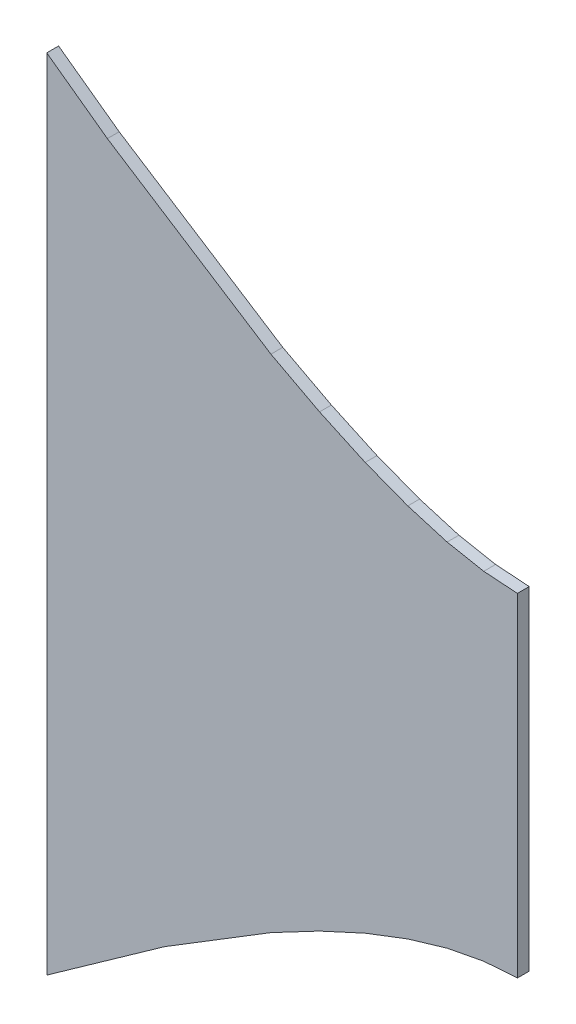
ISO-10303-21;
HEADER;
FILE_DESCRIPTION(('STEP AP214'),'2;1');
FILE_NAME('part.step','',(''),(''),'','','');
FILE_SCHEMA(('AUTOMOTIVE_DESIGN { 1 0 10303 214 1 1 1 1 }'));
ENDSEC;
DATA;
#1=APPLICATION_CONTEXT('core data for automotive mechanical design processes');
#2=APPLICATION_PROTOCOL_DEFINITION('international standard','automotive_design',2000,#1);
#3=PRODUCT_CONTEXT('',#1,'mechanical');
#4=PRODUCT('Part','Part','',(#3));
#5=PRODUCT_RELATED_PRODUCT_CATEGORY('part','',(#4));
#6=PRODUCT_DEFINITION_FORMATION('','',#4);
#7=PRODUCT_DEFINITION_CONTEXT('part definition',#1,'design');
#8=PRODUCT_DEFINITION('design','',#6,#7);
#9=PRODUCT_DEFINITION_SHAPE('','',#8);
#10=(LENGTH_UNIT() NAMED_UNIT(*) SI_UNIT(.MILLI.,.METRE.));
#11=(NAMED_UNIT(*) PLANE_ANGLE_UNIT() SI_UNIT($,.RADIAN.));
#12=(NAMED_UNIT(*) SI_UNIT($,.STERADIAN.) SOLID_ANGLE_UNIT());
#13=UNCERTAINTY_MEASURE_WITH_UNIT(LENGTH_MEASURE(1.E-05),#10,'distance_accuracy_value','');
#14=(GEOMETRIC_REPRESENTATION_CONTEXT(3) GLOBAL_UNCERTAINTY_ASSIGNED_CONTEXT((#13)) GLOBAL_UNIT_ASSIGNED_CONTEXT((#10,
#11,#12)) REPRESENTATION_CONTEXT('',''));
#15=CARTESIAN_POINT('',(0.,0.,0.));
#16=DIRECTION('',(0.,0.,1.));
#17=DIRECTION('',(1.,0.,0.));
#18=AXIS2_PLACEMENT_3D('',#15,#16,#17);
#19=CARTESIAN_POINT('',(66.213996887207,43.,0.));
#20=DIRECTION('',(-0.0691421856130917,-0.997606815418101,0.));
#21=DIRECTION('',(-0.997606815418101,0.0691421856130917,0.));
#22=AXIS2_PLACEMENT_3D('',#19,#20,#21);
#23=PLANE('',#22);
#24=DIRECTION('',(-0.997606815418101,0.0691421856130917,0.));
#25=VECTOR('',#24,1.);
#26=CARTESIAN_POINT('',(66.213996887207,43.,0.03556));
#27=LINE('',#26,#25);
#28=CARTESIAN_POINT('',(66.213996887207,43.,0.03556));
#29=VERTEX_POINT('',#28);
#30=CARTESIAN_POINT('',(66.1129989624023,43.0069999694824,0.03556));
#31=VERTEX_POINT('',#30);
#32=EDGE_CURVE('E11',#29,#31,#27,.T.);
#33=ORIENTED_EDGE('',*,*,#32,.F.);
#34=DIRECTION('',(0.,0.,1.));
#35=VECTOR('',#34,1.);
#36=CARTESIAN_POINT('',(66.213996887207,43.,0.));
#37=LINE('',#36,#35);
#38=CARTESIAN_POINT('',(66.213996887207,43.,0.));
#39=VERTEX_POINT('',#38);
#40=EDGE_CURVE('E24',#39,#29,#37,.T.);
#41=ORIENTED_EDGE('',*,*,#40,.F.);
#42=DIRECTION('',(-0.997606815418101,0.0691421856130917,0.));
#43=VECTOR('',#42,1.);
#44=CARTESIAN_POINT('',(66.213996887207,43.,0.));
#45=LINE('',#44,#43);
#46=CARTESIAN_POINT('',(66.1129989624023,43.0069999694824,0.));
#47=VERTEX_POINT('',#46);
#48=EDGE_CURVE('E160',#39,#47,#45,.T.);
#49=ORIENTED_EDGE('',*,*,#48,.T.);
#50=DIRECTION('',(0.,0.,1.));
#51=VECTOR('',#50,1.);
#52=CARTESIAN_POINT('',(66.1129989624023,43.0069999694824,0.));
#53=LINE('',#52,#51);
#54=EDGE_CURVE('E37',#47,#31,#53,.T.);
#55=ORIENTED_EDGE('',*,*,#54,.T.);
#56=EDGE_LOOP('',(#33,#41,#49,#55));
#57=FACE_BOUND('',#56,.T.);
#58=ADVANCED_FACE('F17',(#57),#23,.F.);
#59=CARTESIAN_POINT('',(66.1129989624023,43.0069999694824,0.));
#60=DIRECTION('',(-0.18752063241692,-0.982260664191516,0.));
#61=DIRECTION('',(-0.982260664191516,0.18752063241692,0.));
#62=AXIS2_PLACEMENT_3D('',#59,#60,#61);
#63=PLANE('',#62);
#64=DIRECTION('',(-0.982260664191516,0.18752063241692,0.));
#65=VECTOR('',#64,1.);
#66=CARTESIAN_POINT('',(66.1129989624023,43.0069999694824,0.03556));
#67=LINE('',#66,#65);
#68=CARTESIAN_POINT('',(66.0029983520508,43.0279998779297,0.03556));
#69=VERTEX_POINT('',#68);
#70=EDGE_CURVE('E280',#31,#69,#67,.T.);
#71=ORIENTED_EDGE('',*,*,#70,.F.);
#72=ORIENTED_EDGE('',*,*,#54,.F.);
#73=DIRECTION('',(-0.982260664191516,0.18752063241692,0.));
#74=VECTOR('',#73,1.);
#75=CARTESIAN_POINT('',(66.1129989624023,43.0069999694824,0.));
#76=LINE('',#75,#74);
#77=CARTESIAN_POINT('',(66.0029983520508,43.0279998779297,0.));
#78=VERTEX_POINT('',#77);
#79=EDGE_CURVE('E277',#47,#78,#76,.T.);
#80=ORIENTED_EDGE('',*,*,#79,.T.);
#81=DIRECTION('',(0.,0.,1.));
#82=VECTOR('',#81,1.);
#83=CARTESIAN_POINT('',(66.0029983520508,43.0279998779297,0.));
#84=LINE('',#83,#82);
#85=EDGE_CURVE('E275',#78,#69,#84,.T.);
#86=ORIENTED_EDGE('',*,*,#85,.T.);
#87=EDGE_LOOP('',(#71,#72,#80,#86));
#88=FACE_BOUND('',#87,.T.);
#89=ADVANCED_FACE('F288',(#88),#63,.F.);
#90=CARTESIAN_POINT('',(66.0029983520508,43.0279998779297,0.));
#91=DIRECTION('',(-0.284372190121849,-0.958713960201531,0.));
#92=DIRECTION('',(-0.958713960201531,0.284372190121849,0.));
#93=AXIS2_PLACEMENT_3D('',#90,#91,#92);
#94=PLANE('',#93);
#95=DIRECTION('',(-0.958713960201531,0.284372190121849,0.));
#96=VECTOR('',#95,1.);
#97=CARTESIAN_POINT('',(66.0029983520508,43.0279998779297,0.03556));
#98=LINE('',#97,#96);
#99=CARTESIAN_POINT('',(65.8850021362305,43.0629997253418,0.03556));
#100=VERTEX_POINT('',#99);
#101=EDGE_CURVE('E272',#69,#100,#98,.T.);
#102=ORIENTED_EDGE('',*,*,#101,.F.);
#103=ORIENTED_EDGE('',*,*,#85,.F.);
#104=DIRECTION('',(-0.958713960201531,0.284372190121849,0.));
#105=VECTOR('',#104,1.);
#106=CARTESIAN_POINT('',(66.0029983520508,43.0279998779297,0.));
#107=LINE('',#106,#105);
#108=CARTESIAN_POINT('',(65.8850021362305,43.0629997253418,0.));
#109=VERTEX_POINT('',#108);
#110=EDGE_CURVE('E269',#78,#109,#107,.T.);
#111=ORIENTED_EDGE('',*,*,#110,.T.);
#112=DIRECTION('',(0.,0.,1.));
#113=VECTOR('',#112,1.);
#114=CARTESIAN_POINT('',(65.8850021362305,43.0629997253418,0.));
#115=LINE('',#114,#113);
#116=EDGE_CURVE('E267',#109,#100,#115,.T.);
#117=ORIENTED_EDGE('',*,*,#116,.T.);
#118=EDGE_LOOP('',(#102,#103,#111,#117));
#119=FACE_BOUND('',#118,.T.);
#120=ADVANCED_FACE('F294',(#119),#94,.F.);
#121=CARTESIAN_POINT('',(65.8850021362305,43.0629997253418,0.));
#122=DIRECTION('',(-0.357514537183552,-0.933907573425995,0.));
#123=DIRECTION('',(-0.933907573425995,0.357514537183552,0.));
#124=AXIS2_PLACEMENT_3D('',#121,#122,#123);
#125=PLANE('',#124);
#126=DIRECTION('',(-0.933907573425995,0.357514537183552,0.));
#127=VECTOR('',#126,1.);
#128=CARTESIAN_POINT('',(65.8850021362305,43.0629997253418,0.03556));
#129=LINE('',#128,#127);
#130=CARTESIAN_POINT('',(65.7570037841797,43.1119995117188,0.03556));
#131=VERTEX_POINT('',#130);
#132=EDGE_CURVE('E264',#100,#131,#129,.T.);
#133=ORIENTED_EDGE('',*,*,#132,.F.);
#134=ORIENTED_EDGE('',*,*,#116,.F.);
#135=DIRECTION('',(-0.933907573425995,0.357514537183552,0.));
#136=VECTOR('',#135,1.);
#137=CARTESIAN_POINT('',(65.8850021362305,43.0629997253418,0.));
#138=LINE('',#137,#136);
#139=CARTESIAN_POINT('',(65.7570037841797,43.1119995117188,0.));
#140=VERTEX_POINT('',#139);
#141=EDGE_CURVE('E261',#109,#140,#138,.T.);
#142=ORIENTED_EDGE('',*,*,#141,.T.);
#143=DIRECTION('',(0.,0.,1.));
#144=VECTOR('',#143,1.);
#145=CARTESIAN_POINT('',(65.7570037841797,43.1119995117188,0.));
#146=LINE('',#145,#144);
#147=EDGE_CURVE('E259',#140,#131,#146,.T.);
#148=ORIENTED_EDGE('',*,*,#147,.T.);
#149=EDGE_LOOP('',(#133,#134,#142,#148));
#150=FACE_BOUND('',#149,.T.);
#151=ADVANCED_FACE('F296',(#150),#125,.F.);
#152=CARTESIAN_POINT('',(65.7570037841797,43.1119995117188,0.));
#153=DIRECTION('',(-0.417792019909642,-0.908542694703898,0.));
#154=DIRECTION('',(-0.908542694703898,0.417792019909642,0.));
#155=AXIS2_PLACEMENT_3D('',#152,#153,#154);
#156=PLANE('',#155);
#157=DIRECTION('',(-0.908542694703898,0.417792019909642,0.));
#158=VECTOR('',#157,1.);
#159=CARTESIAN_POINT('',(65.7570037841797,43.1119995117188,0.03556));
#160=LINE('',#159,#158);
#161=CARTESIAN_POINT('',(65.620002746582,43.1749992370605,0.03556));
#162=VERTEX_POINT('',#161);
#163=EDGE_CURVE('E256',#131,#162,#160,.T.);
#164=ORIENTED_EDGE('',*,*,#163,.F.);
#165=ORIENTED_EDGE('',*,*,#147,.F.);
#166=DIRECTION('',(-0.908542694703898,0.417792019909642,0.));
#167=VECTOR('',#166,1.);
#168=CARTESIAN_POINT('',(65.7570037841797,43.1119995117188,0.));
#169=LINE('',#168,#167);
#170=CARTESIAN_POINT('',(65.620002746582,43.1749992370605,0.));
#171=VERTEX_POINT('',#170);
#172=EDGE_CURVE('E253',#140,#171,#169,.T.);
#173=ORIENTED_EDGE('',*,*,#172,.T.);
#174=DIRECTION('',(0.,0.,1.));
#175=VECTOR('',#174,1.);
#176=CARTESIAN_POINT('',(65.620002746582,43.1749992370605,0.));
#177=LINE('',#176,#175);
#178=EDGE_CURVE('E251',#171,#162,#177,.T.);
#179=ORIENTED_EDGE('',*,*,#178,.T.);
#180=EDGE_LOOP('',(#164,#165,#173,#179));
#181=FACE_BOUND('',#180,.T.);
#182=ADVANCED_FACE('F301',(#181),#156,.F.);
#183=CARTESIAN_POINT('',(65.620002746582,43.1749992370605,0.));
#184=DIRECTION('',(-0.466484451675092,-0.884529398236932,0.));
#185=DIRECTION('',(-0.884529398236932,0.466484451675092,0.));
#186=AXIS2_PLACEMENT_3D('',#183,#184,#185);
#187=PLANE('',#186);
#188=DIRECTION('',(-0.884529398236932,0.466484451675092,0.));
#189=VECTOR('',#188,1.);
#190=CARTESIAN_POINT('',(65.620002746582,43.1749992370605,0.03556));
#191=LINE('',#190,#189);
#192=CARTESIAN_POINT('',(65.4739990234375,43.2519989013672,0.03556));
#193=VERTEX_POINT('',#192);
#194=EDGE_CURVE('E248',#162,#193,#191,.T.);
#195=ORIENTED_EDGE('',*,*,#194,.F.);
#196=ORIENTED_EDGE('',*,*,#178,.F.);
#197=DIRECTION('',(-0.884529398236932,0.466484451675092,0.));
#198=VECTOR('',#197,1.);
#199=CARTESIAN_POINT('',(65.620002746582,43.1749992370605,0.));
#200=LINE('',#199,#198);
#201=CARTESIAN_POINT('',(65.4739990234375,43.2519989013672,0.));
#202=VERTEX_POINT('',#201);
#203=EDGE_CURVE('E245',#171,#202,#200,.T.);
#204=ORIENTED_EDGE('',*,*,#203,.T.);
#205=DIRECTION('',(0.,0.,1.));
#206=VECTOR('',#205,1.);
#207=CARTESIAN_POINT('',(65.4739990234375,43.2519989013672,0.));
#208=LINE('',#207,#206);
#209=EDGE_CURVE('E243',#202,#193,#208,.T.);
#210=ORIENTED_EDGE('',*,*,#209,.T.);
#211=EDGE_LOOP('',(#195,#196,#204,#210));
#212=FACE_BOUND('',#211,.T.);
#213=ADVANCED_FACE('F304',(#212),#187,.F.);
#214=CARTESIAN_POINT('',(65.4739990234375,43.2519989013672,0.));
#215=DIRECTION('',(-0.539982665026662,-0.841676138114122,0.));
#216=DIRECTION('',(-0.841676138114122,0.539982665026662,0.));
#217=AXIS2_PLACEMENT_3D('',#214,#215,#216);
#218=PLANE('',#217);
#219=DIRECTION('',(-0.841676138114122,0.539982665026662,0.));
#220=VECTOR('',#219,1.);
#221=CARTESIAN_POINT('',(65.4739990234375,43.2519989013672,0.03556));
#222=LINE('',#221,#220);
#223=CARTESIAN_POINT('',(64.9830017089844,43.5670013427734,0.03556));
#224=VERTEX_POINT('',#223);
#225=EDGE_CURVE('E240',#193,#224,#222,.T.);
#226=ORIENTED_EDGE('',*,*,#225,.F.);
#227=ORIENTED_EDGE('',*,*,#209,.F.);
#228=DIRECTION('',(-0.841676138114122,0.539982665026662,0.));
#229=VECTOR('',#228,1.);
#230=CARTESIAN_POINT('',(65.4739990234375,43.2519989013672,0.));
#231=LINE('',#230,#229);
#232=CARTESIAN_POINT('',(64.9830017089844,43.5670013427734,0.));
#233=VERTEX_POINT('',#232);
#234=EDGE_CURVE('E237',#202,#233,#231,.T.);
#235=ORIENTED_EDGE('',*,*,#234,.T.);
#236=DIRECTION('',(0.,0.,1.));
#237=VECTOR('',#236,1.);
#238=CARTESIAN_POINT('',(64.9830017089844,43.5670013427734,0.));
#239=LINE('',#238,#237);
#240=EDGE_CURVE('E235',#233,#224,#239,.T.);
#241=ORIENTED_EDGE('',*,*,#240,.T.);
#242=EDGE_LOOP('',(#226,#227,#235,#241));
#243=FACE_BOUND('',#242,.T.);
#244=ADVANCED_FACE('F309',(#243),#218,.F.);
#245=CARTESIAN_POINT('',(64.9830017089844,43.5670013427734,0.));
#246=DIRECTION('',(-0.587114921003167,-0.809503594516692,0.));
#247=DIRECTION('',(-0.809503594516692,0.587114921003167,0.));
#248=AXIS2_PLACEMENT_3D('',#245,#246,#247);
#249=PLANE('',#248);
#250=DIRECTION('',(-0.809503594516692,0.587114921003167,0.));
#251=VECTOR('',#250,1.);
#252=CARTESIAN_POINT('',(64.9830017089844,43.5670013427734,0.03556));
#253=LINE('',#252,#251);
#254=CARTESIAN_POINT('',(64.8010025024414,43.6990013122559,0.03556));
#255=VERTEX_POINT('',#254);
#256=EDGE_CURVE('E232',#224,#255,#253,.T.);
#257=ORIENTED_EDGE('',*,*,#256,.F.);
#258=ORIENTED_EDGE('',*,*,#240,.F.);
#259=DIRECTION('',(-0.809503594516692,0.587114921003167,0.));
#260=VECTOR('',#259,1.);
#261=CARTESIAN_POINT('',(64.9830017089844,43.5670013427734,0.));
#262=LINE('',#261,#260);
#263=CARTESIAN_POINT('',(64.8010025024414,43.6990013122559,0.));
#264=VERTEX_POINT('',#263);
#265=EDGE_CURVE('E229',#233,#264,#262,.T.);
#266=ORIENTED_EDGE('',*,*,#265,.T.);
#267=DIRECTION('',(0.,0.,1.));
#268=VECTOR('',#267,1.);
#269=CARTESIAN_POINT('',(64.8010025024414,43.6990013122559,0.));
#270=LINE('',#269,#268);
#271=EDGE_CURVE('E227',#264,#255,#270,.T.);
#272=ORIENTED_EDGE('',*,*,#271,.T.);
#273=EDGE_LOOP('',(#257,#258,#266,#272));
#274=FACE_BOUND('',#273,.T.);
#275=ADVANCED_FACE('F312',(#274),#249,.F.);
#276=CARTESIAN_POINT('',(64.8010025024414,43.6990013122559,0.));
#277=DIRECTION('',(1.,0.,0.));
#278=DIRECTION('',(0.,-1.,0.));
#279=AXIS2_PLACEMENT_3D('',#276,#277,#278);
#280=PLANE('',#279);
#281=DIRECTION('',(0.,-1.,0.));
#282=VECTOR('',#281,1.);
#283=CARTESIAN_POINT('',(64.8010025024414,43.6990013122559,0.03556));
#284=LINE('',#283,#282);
#285=CARTESIAN_POINT('',(64.8010025024414,41.3009986877441,0.03556));
#286=VERTEX_POINT('',#285);
#287=EDGE_CURVE('E224',#255,#286,#284,.T.);
#288=ORIENTED_EDGE('',*,*,#287,.F.);
#289=ORIENTED_EDGE('',*,*,#271,.F.);
#290=DIRECTION('',(0.,-1.,0.));
#291=VECTOR('',#290,1.);
#292=CARTESIAN_POINT('',(64.8010025024414,43.6990013122559,0.));
#293=LINE('',#292,#291);
#294=CARTESIAN_POINT('',(64.8010025024414,41.3009986877441,0.));
#295=VERTEX_POINT('',#294);
#296=EDGE_CURVE('E221',#264,#295,#293,.T.);
#297=ORIENTED_EDGE('',*,*,#296,.T.);
#298=DIRECTION('',(0.,0.,1.));
#299=VECTOR('',#298,1.);
#300=CARTESIAN_POINT('',(64.8010025024414,41.3009986877441,0.));
#301=LINE('',#300,#299);
#302=EDGE_CURVE('E219',#295,#286,#301,.T.);
#303=ORIENTED_EDGE('',*,*,#302,.T.);
#304=EDGE_LOOP('',(#288,#289,#297,#303));
#305=FACE_BOUND('',#304,.T.);
#306=ADVANCED_FACE('F317',(#305),#280,.F.);
#307=CARTESIAN_POINT('',(64.8010025024414,41.3009986877442,0.));
#308=DIRECTION('',(-0.578404103023174,0.815750386825503,0.));
#309=DIRECTION('',(0.815750386825503,0.578404103023174,0.));
#310=AXIS2_PLACEMENT_3D('',#307,#308,#309);
#311=PLANE('',#310);
#312=DIRECTION('',(0.815750386825503,0.578404103023174,0.));
#313=VECTOR('',#312,1.);
#314=CARTESIAN_POINT('',(64.8010025024414,41.3009986877441,0.03556));
#315=LINE('',#314,#313);
#316=CARTESIAN_POINT('',(65.1549987792969,41.5519981384277,0.03556));
#317=VERTEX_POINT('',#316);
#318=EDGE_CURVE('E216',#286,#317,#315,.T.);
#319=ORIENTED_EDGE('',*,*,#318,.F.);
#320=ORIENTED_EDGE('',*,*,#302,.F.);
#321=DIRECTION('',(0.815750386825503,0.578404103023174,0.));
#322=VECTOR('',#321,1.);
#323=CARTESIAN_POINT('',(64.8010025024414,41.3009986877441,0.));
#324=LINE('',#323,#322);
#325=CARTESIAN_POINT('',(65.1549987792969,41.5519981384277,0.));
#326=VERTEX_POINT('',#325);
#327=EDGE_CURVE('E213',#295,#326,#324,.T.);
#328=ORIENTED_EDGE('',*,*,#327,.T.);
#329=DIRECTION('',(0.,0.,1.));
#330=VECTOR('',#329,1.);
#331=CARTESIAN_POINT('',(65.1549987792969,41.5519981384277,0.));
#332=LINE('',#331,#330);
#333=EDGE_CURVE('E211',#326,#317,#332,.T.);
#334=ORIENTED_EDGE('',*,*,#333,.T.);
#335=EDGE_LOOP('',(#319,#320,#328,#334));
#336=FACE_BOUND('',#335,.T.);
#337=ADVANCED_FACE('F320',(#336),#311,.F.);
#338=CARTESIAN_POINT('',(65.1549987792969,41.5519981384277,0.));
#339=DIRECTION('',(-0.523506659924223,0.852021582481914,0.));
#340=DIRECTION('',(0.852021582481914,0.523506659924223,0.));
#341=AXIS2_PLACEMENT_3D('',#338,#339,#340);
#342=PLANE('',#341);
#343=DIRECTION('',(0.852021582481914,0.523506659924223,0.));
#344=VECTOR('',#343,1.);
#345=CARTESIAN_POINT('',(65.1549987792969,41.5519981384277,0.03556));
#346=LINE('',#345,#344);
#347=CARTESIAN_POINT('',(65.4739990234375,41.7480010986328,0.03556));
#348=VERTEX_POINT('',#347);
#349=EDGE_CURVE('E208',#317,#348,#346,.T.);
#350=ORIENTED_EDGE('',*,*,#349,.F.);
#351=ORIENTED_EDGE('',*,*,#333,.F.);
#352=DIRECTION('',(0.852021582481914,0.523506659924223,0.));
#353=VECTOR('',#352,1.);
#354=CARTESIAN_POINT('',(65.1549987792969,41.5519981384277,0.));
#355=LINE('',#354,#353);
#356=CARTESIAN_POINT('',(65.4739990234375,41.7480010986328,0.));
#357=VERTEX_POINT('',#356);
#358=EDGE_CURVE('E205',#326,#357,#355,.T.);
#359=ORIENTED_EDGE('',*,*,#358,.T.);
#360=DIRECTION('',(0.,0.,1.));
#361=VECTOR('',#360,1.);
#362=CARTESIAN_POINT('',(65.4739990234375,41.7480010986328,0.));
#363=LINE('',#362,#361);
#364=EDGE_CURVE('E203',#357,#348,#363,.T.);
#365=ORIENTED_EDGE('',*,*,#364,.T.);
#366=EDGE_LOOP('',(#350,#351,#359,#365));
#367=FACE_BOUND('',#366,.T.);
#368=ADVANCED_FACE('F325',(#367),#342,.F.);
#369=CARTESIAN_POINT('',(65.4739990234375,41.7480010986328,0.));
#370=DIRECTION('',(-0.466484451675092,0.884529398236932,0.));
#371=DIRECTION('',(0.884529398236932,0.466484451675092,0.));
#372=AXIS2_PLACEMENT_3D('',#369,#370,#371);
#373=PLANE('',#372);
#374=DIRECTION('',(0.884529398236932,0.466484451675092,0.));
#375=VECTOR('',#374,1.);
#376=CARTESIAN_POINT('',(65.4739990234375,41.7480010986328,0.03556));
#377=LINE('',#376,#375);
#378=CARTESIAN_POINT('',(65.620002746582,41.8250007629395,0.03556));
#379=VERTEX_POINT('',#378);
#380=EDGE_CURVE('E200',#348,#379,#377,.T.);
#381=ORIENTED_EDGE('',*,*,#380,.F.);
#382=ORIENTED_EDGE('',*,*,#364,.F.);
#383=DIRECTION('',(0.884529398236932,0.466484451675092,0.));
#384=VECTOR('',#383,1.);
#385=CARTESIAN_POINT('',(65.4739990234375,41.7480010986328,0.));
#386=LINE('',#385,#384);
#387=CARTESIAN_POINT('',(65.620002746582,41.8250007629395,0.));
#388=VERTEX_POINT('',#387);
#389=EDGE_CURVE('E197',#357,#388,#386,.T.);
#390=ORIENTED_EDGE('',*,*,#389,.T.);
#391=DIRECTION('',(0.,0.,1.));
#392=VECTOR('',#391,1.);
#393=CARTESIAN_POINT('',(65.620002746582,41.8250007629395,0.));
#394=LINE('',#393,#392);
#395=EDGE_CURVE('E195',#388,#379,#394,.T.);
#396=ORIENTED_EDGE('',*,*,#395,.T.);
#397=EDGE_LOOP('',(#381,#382,#390,#396));
#398=FACE_BOUND('',#397,.T.);
#399=ADVANCED_FACE('F328',(#398),#373,.F.);
#400=CARTESIAN_POINT('',(65.620002746582,41.8250007629395,0.));
#401=DIRECTION('',(-0.417792019909642,0.908542694703898,0.));
#402=DIRECTION('',(0.908542694703898,0.417792019909642,0.));
#403=AXIS2_PLACEMENT_3D('',#400,#401,#402);
#404=PLANE('',#403);
#405=DIRECTION('',(0.908542694703898,0.417792019909642,0.));
#406=VECTOR('',#405,1.);
#407=CARTESIAN_POINT('',(65.620002746582,41.8250007629395,0.03556));
#408=LINE('',#407,#406);
#409=CARTESIAN_POINT('',(65.7570037841797,41.8880004882812,0.03556));
#410=VERTEX_POINT('',#409);
#411=EDGE_CURVE('E192',#379,#410,#408,.T.);
#412=ORIENTED_EDGE('',*,*,#411,.F.);
#413=ORIENTED_EDGE('',*,*,#395,.F.);
#414=DIRECTION('',(0.908542694703898,0.417792019909642,0.));
#415=VECTOR('',#414,1.);
#416=CARTESIAN_POINT('',(65.620002746582,41.8250007629395,0.));
#417=LINE('',#416,#415);
#418=CARTESIAN_POINT('',(65.7570037841797,41.8880004882812,0.));
#419=VERTEX_POINT('',#418);
#420=EDGE_CURVE('E189',#388,#419,#417,.T.);
#421=ORIENTED_EDGE('',*,*,#420,.T.);
#422=DIRECTION('',(0.,0.,1.));
#423=VECTOR('',#422,1.);
#424=CARTESIAN_POINT('',(65.7570037841797,41.8880004882812,0.));
#425=LINE('',#424,#423);
#426=EDGE_CURVE('E187',#419,#410,#425,.T.);
#427=ORIENTED_EDGE('',*,*,#426,.T.);
#428=EDGE_LOOP('',(#412,#413,#421,#427));
#429=FACE_BOUND('',#428,.T.);
#430=ADVANCED_FACE('F333',(#429),#404,.F.);
#431=CARTESIAN_POINT('',(65.7570037841797,41.8880004882812,0.));
#432=DIRECTION('',(-0.357514537183552,0.933907573425995,0.));
#433=DIRECTION('',(0.933907573425995,0.357514537183552,0.));
#434=AXIS2_PLACEMENT_3D('',#431,#432,#433);
#435=PLANE('',#434);
#436=DIRECTION('',(0.933907573425995,0.357514537183552,0.));
#437=VECTOR('',#436,1.);
#438=CARTESIAN_POINT('',(65.7570037841797,41.8880004882812,0.03556));
#439=LINE('',#438,#437);
#440=CARTESIAN_POINT('',(65.8850021362305,41.9370002746582,0.03556));
#441=VERTEX_POINT('',#440);
#442=EDGE_CURVE('E184',#410,#441,#439,.T.);
#443=ORIENTED_EDGE('',*,*,#442,.F.);
#444=ORIENTED_EDGE('',*,*,#426,.F.);
#445=DIRECTION('',(0.933907573425995,0.357514537183552,0.));
#446=VECTOR('',#445,1.);
#447=CARTESIAN_POINT('',(65.7570037841797,41.8880004882812,0.));
#448=LINE('',#447,#446);
#449=CARTESIAN_POINT('',(65.8850021362305,41.9370002746582,0.));
#450=VERTEX_POINT('',#449);
#451=EDGE_CURVE('E181',#419,#450,#448,.T.);
#452=ORIENTED_EDGE('',*,*,#451,.T.);
#453=DIRECTION('',(0.,0.,1.));
#454=VECTOR('',#453,1.);
#455=CARTESIAN_POINT('',(65.8850021362305,41.9370002746582,0.));
#456=LINE('',#455,#454);
#457=EDGE_CURVE('E179',#450,#441,#456,.T.);
#458=ORIENTED_EDGE('',*,*,#457,.T.);
#459=EDGE_LOOP('',(#443,#444,#452,#458));
#460=FACE_BOUND('',#459,.T.);
#461=ADVANCED_FACE('F336',(#460),#435,.F.);
#462=CARTESIAN_POINT('',(65.8850021362305,41.9370002746582,0.));
#463=DIRECTION('',(-0.284372190121849,0.958713960201531,0.));
#464=DIRECTION('',(0.958713960201531,0.284372190121849,0.));
#465=AXIS2_PLACEMENT_3D('',#462,#463,#464);
#466=PLANE('',#465);
#467=DIRECTION('',(0.958713960201531,0.284372190121849,0.));
#468=VECTOR('',#467,1.);
#469=CARTESIAN_POINT('',(65.8850021362305,41.9370002746582,0.03556));
#470=LINE('',#469,#468);
#471=CARTESIAN_POINT('',(66.0029983520508,41.9720001220703,0.03556));
#472=VERTEX_POINT('',#471);
#473=EDGE_CURVE('E176',#441,#472,#470,.T.);
#474=ORIENTED_EDGE('',*,*,#473,.F.);
#475=ORIENTED_EDGE('',*,*,#457,.F.);
#476=DIRECTION('',(0.958713960201531,0.284372190121849,0.));
#477=VECTOR('',#476,1.);
#478=CARTESIAN_POINT('',(65.8850021362305,41.9370002746582,0.));
#479=LINE('',#478,#477);
#480=CARTESIAN_POINT('',(66.0029983520508,41.9720001220703,0.));
#481=VERTEX_POINT('',#480);
#482=EDGE_CURVE('E173',#450,#481,#479,.T.);
#483=ORIENTED_EDGE('',*,*,#482,.T.);
#484=DIRECTION('',(0.,0.,1.));
#485=VECTOR('',#484,1.);
#486=CARTESIAN_POINT('',(66.0029983520508,41.9720001220703,0.));
#487=LINE('',#486,#485);
#488=EDGE_CURVE('E171',#481,#472,#487,.T.);
#489=ORIENTED_EDGE('',*,*,#488,.T.);
#490=EDGE_LOOP('',(#474,#475,#483,#489));
#491=FACE_BOUND('',#490,.T.);
#492=ADVANCED_FACE('F341',(#491),#466,.F.);
#493=CARTESIAN_POINT('',(66.0029983520508,41.9720001220703,0.));
#494=DIRECTION('',(-0.18752063241692,0.982260664191516,0.));
#495=DIRECTION('',(0.982260664191516,0.18752063241692,0.));
#496=AXIS2_PLACEMENT_3D('',#493,#494,#495);
#497=PLANE('',#496);
#498=DIRECTION('',(0.982260664191516,0.18752063241692,0.));
#499=VECTOR('',#498,1.);
#500=CARTESIAN_POINT('',(66.0029983520508,41.9720001220703,0.03556));
#501=LINE('',#500,#499);
#502=CARTESIAN_POINT('',(66.1129989624023,41.9930000305176,0.03556));
#503=VERTEX_POINT('',#502);
#504=EDGE_CURVE('E168',#472,#503,#501,.T.);
#505=ORIENTED_EDGE('',*,*,#504,.F.);
#506=ORIENTED_EDGE('',*,*,#488,.F.);
#507=DIRECTION('',(0.982260664191516,0.18752063241692,0.));
#508=VECTOR('',#507,1.);
#509=CARTESIAN_POINT('',(66.0029983520508,41.9720001220703,0.));
#510=LINE('',#509,#508);
#511=CARTESIAN_POINT('',(66.1129989624023,41.9930000305176,0.));
#512=VERTEX_POINT('',#511);
#513=EDGE_CURVE('E166',#481,#512,#510,.T.);
#514=ORIENTED_EDGE('',*,*,#513,.T.);
#515=DIRECTION('',(0.,0.,1.));
#516=VECTOR('',#515,1.);
#517=CARTESIAN_POINT('',(66.1129989624023,41.9930000305176,0.));
#518=LINE('',#517,#516);
#519=EDGE_CURVE('E151',#512,#503,#518,.T.);
#520=ORIENTED_EDGE('',*,*,#519,.T.);
#521=EDGE_LOOP('',(#505,#506,#514,#520));
#522=FACE_BOUND('',#521,.T.);
#523=ADVANCED_FACE('F343',(#522),#497,.F.);
#524=CARTESIAN_POINT('',(66.1129989624023,41.9930000305176,0.));
#525=DIRECTION('',(-0.0691421856130917,0.997606815418101,0.));
#526=DIRECTION('',(0.997606815418101,0.0691421856130917,0.));
#527=AXIS2_PLACEMENT_3D('',#524,#525,#526);
#528=PLANE('',#527);
#529=DIRECTION('',(0.997606815418101,0.0691421856130917,0.));
#530=VECTOR('',#529,1.);
#531=CARTESIAN_POINT('',(66.1129989624023,41.9930000305176,0.03556));
#532=LINE('',#531,#530);
#533=CARTESIAN_POINT('',(66.213996887207,42.,0.03556));
#534=VERTEX_POINT('',#533);
#535=EDGE_CURVE('E155',#503,#534,#532,.T.);
#536=ORIENTED_EDGE('',*,*,#535,.F.);
#537=ORIENTED_EDGE('',*,*,#519,.F.);
#538=DIRECTION('',(0.997606815418101,0.0691421856130917,0.));
#539=VECTOR('',#538,1.);
#540=CARTESIAN_POINT('',(66.1129989624023,41.9930000305176,0.));
#541=LINE('',#540,#539);
#542=CARTESIAN_POINT('',(66.213996887207,42.,0.));
#543=VERTEX_POINT('',#542);
#544=EDGE_CURVE('E147',#512,#543,#541,.T.);
#545=ORIENTED_EDGE('',*,*,#544,.T.);
#546=DIRECTION('',(0.,0.,1.));
#547=VECTOR('',#546,1.);
#548=CARTESIAN_POINT('',(66.213996887207,42.,0.));
#549=LINE('',#548,#547);
#550=EDGE_CURVE('E137',#543,#534,#549,.T.);
#551=ORIENTED_EDGE('',*,*,#550,.T.);
#552=EDGE_LOOP('',(#536,#537,#545,#551));
#553=FACE_BOUND('',#552,.T.);
#554=ADVANCED_FACE('F150',(#553),#528,.F.);
#555=CARTESIAN_POINT('',(66.213996887207,42.,0.));
#556=DIRECTION('',(-1.,0.,0.));
#557=DIRECTION('',(0.,1.,0.));
#558=AXIS2_PLACEMENT_3D('',#555,#556,#557);
#559=PLANE('',#558);
#560=DIRECTION('',(0.,1.,0.));
#561=VECTOR('',#560,1.);
#562=CARTESIAN_POINT('',(66.213996887207,42.,0.03556));
#563=LINE('',#562,#561);
#564=EDGE_CURVE('E143',#534,#29,#563,.T.);
#565=ORIENTED_EDGE('',*,*,#564,.F.);
#566=ORIENTED_EDGE('',*,*,#550,.F.);
#567=DIRECTION('',(0.,1.,0.));
#568=VECTOR('',#567,1.);
#569=CARTESIAN_POINT('',(66.213996887207,42.,0.));
#570=LINE('',#569,#568);
#571=EDGE_CURVE('E141',#543,#39,#570,.T.);
#572=ORIENTED_EDGE('',*,*,#571,.T.);
#573=ORIENTED_EDGE('',*,*,#40,.T.);
#574=EDGE_LOOP('',(#565,#566,#572,#573));
#575=FACE_BOUND('',#574,.T.);
#576=ADVANCED_FACE('F139',(#575),#559,.F.);
#577=CARTESIAN_POINT('',(66.213996887207,43.,0.));
#578=DIRECTION('',(0.,0.,1.));
#579=DIRECTION('',(1.,0.,0.));
#580=AXIS2_PLACEMENT_3D('',#577,#578,#579);
#581=PLANE('',#580);
#582=ORIENTED_EDGE('',*,*,#571,.F.);
#583=ORIENTED_EDGE('',*,*,#544,.F.);
#584=ORIENTED_EDGE('',*,*,#513,.F.);
#585=ORIENTED_EDGE('',*,*,#482,.F.);
#586=ORIENTED_EDGE('',*,*,#451,.F.);
#587=ORIENTED_EDGE('',*,*,#420,.F.);
#588=ORIENTED_EDGE('',*,*,#389,.F.);
#589=ORIENTED_EDGE('',*,*,#358,.F.);
#590=ORIENTED_EDGE('',*,*,#327,.F.);
#591=ORIENTED_EDGE('',*,*,#296,.F.);
#592=ORIENTED_EDGE('',*,*,#265,.F.);
#593=ORIENTED_EDGE('',*,*,#234,.F.);
#594=ORIENTED_EDGE('',*,*,#203,.F.);
#595=ORIENTED_EDGE('',*,*,#172,.F.);
#596=ORIENTED_EDGE('',*,*,#141,.F.);
#597=ORIENTED_EDGE('',*,*,#110,.F.);
#598=ORIENTED_EDGE('',*,*,#79,.F.);
#599=ORIENTED_EDGE('',*,*,#48,.F.);
#600=EDGE_LOOP('',(#582,#583,#584,#585,#586,#587,#588,#589,#590,#591,#592,#593,#594,#595,#596,
#597,#598,#599));
#601=FACE_BOUND('',#600,.T.);
#602=ADVANCED_FACE('F158',(#601),#581,.F.);
#603=CARTESIAN_POINT('',(66.213996887207,43.,0.03556));
#604=DIRECTION('',(0.,0.,1.));
#605=DIRECTION('',(1.,0.,0.));
#606=AXIS2_PLACEMENT_3D('',#603,#604,#605);
#607=PLANE('',#606);
#608=ORIENTED_EDGE('',*,*,#32,.T.);
#609=ORIENTED_EDGE('',*,*,#70,.T.);
#610=ORIENTED_EDGE('',*,*,#101,.T.);
#611=ORIENTED_EDGE('',*,*,#132,.T.);
#612=ORIENTED_EDGE('',*,*,#163,.T.);
#613=ORIENTED_EDGE('',*,*,#194,.T.);
#614=ORIENTED_EDGE('',*,*,#225,.T.);
#615=ORIENTED_EDGE('',*,*,#256,.T.);
#616=ORIENTED_EDGE('',*,*,#287,.T.);
#617=ORIENTED_EDGE('',*,*,#318,.T.);
#618=ORIENTED_EDGE('',*,*,#349,.T.);
#619=ORIENTED_EDGE('',*,*,#380,.T.);
#620=ORIENTED_EDGE('',*,*,#411,.T.);
#621=ORIENTED_EDGE('',*,*,#442,.T.);
#622=ORIENTED_EDGE('',*,*,#473,.T.);
#623=ORIENTED_EDGE('',*,*,#504,.T.);
#624=ORIENTED_EDGE('',*,*,#535,.T.);
#625=ORIENTED_EDGE('',*,*,#564,.T.);
#626=EDGE_LOOP('',(#608,#609,#610,#611,#612,#613,#614,#615,#616,#617,#618,#619,#620,#621,#622,
#623,#624,#625));
#627=FACE_BOUND('',#626,.T.);
#628=ADVANCED_FACE('F291',(#627),#607,.T.);
#629=CLOSED_SHELL('',(#58,#89,#120,#151,#182,#213,#244,#275,#306,#337,#368,#399,#430,#461,#492,
#523,#554,#576,#602,#628));
#630=MANIFOLD_SOLID_BREP('B1',#629);
#631=ADVANCED_BREP_SHAPE_REPRESENTATION('',(#18,#630),#14);
#632=SHAPE_DEFINITION_REPRESENTATION(#9,#631);
ENDSEC;
END-ISO-10303-21;
